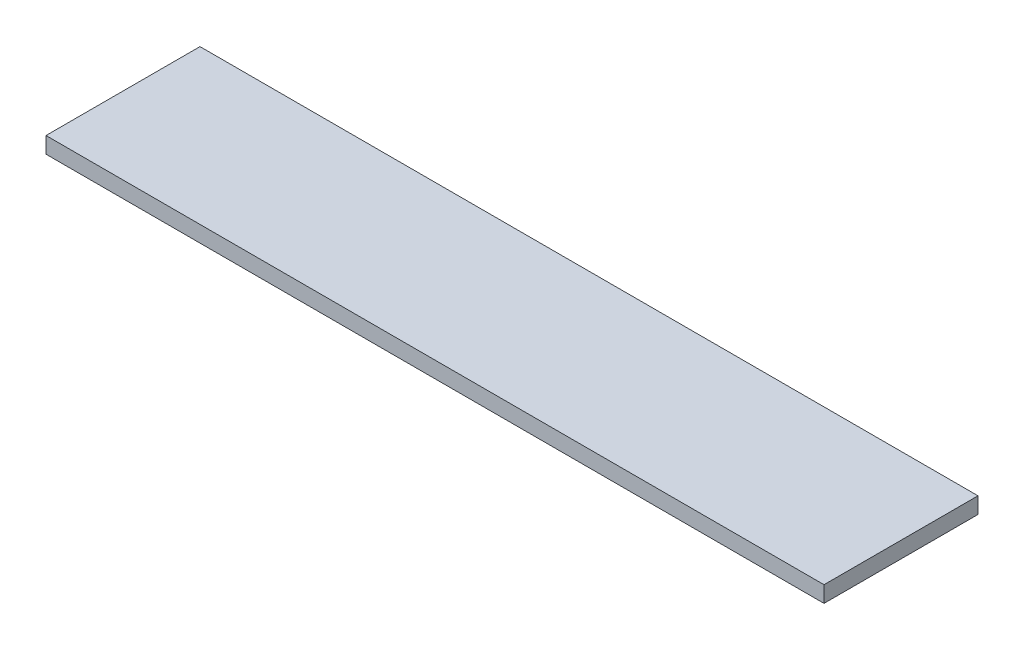
ISO-10303-21;
HEADER;
FILE_DESCRIPTION(('STEP AP214'),'2;1');
FILE_NAME('part.step','',(''),(''),'','','');
FILE_SCHEMA(('AUTOMOTIVE_DESIGN { 1 0 10303 214 1 1 1 1 }'));
ENDSEC;
DATA;
#1=APPLICATION_CONTEXT('core data for automotive mechanical design processes');
#2=APPLICATION_PROTOCOL_DEFINITION('international standard','automotive_design',2000,#1);
#3=PRODUCT_CONTEXT('',#1,'mechanical');
#4=PRODUCT('Part','Part','',(#3));
#5=PRODUCT_RELATED_PRODUCT_CATEGORY('part','',(#4));
#6=PRODUCT_DEFINITION_FORMATION('','',#4);
#7=PRODUCT_DEFINITION_CONTEXT('part definition',#1,'design');
#8=PRODUCT_DEFINITION('design','',#6,#7);
#9=PRODUCT_DEFINITION_SHAPE('','',#8);
#10=(LENGTH_UNIT() NAMED_UNIT(*) SI_UNIT(.MILLI.,.METRE.));
#11=(NAMED_UNIT(*) PLANE_ANGLE_UNIT() SI_UNIT($,.RADIAN.));
#12=(NAMED_UNIT(*) SI_UNIT($,.STERADIAN.) SOLID_ANGLE_UNIT());
#13=UNCERTAINTY_MEASURE_WITH_UNIT(LENGTH_MEASURE(1.E-05),#10,'distance_accuracy_value','');
#14=(GEOMETRIC_REPRESENTATION_CONTEXT(3) GLOBAL_UNCERTAINTY_ASSIGNED_CONTEXT((#13)) GLOBAL_UNIT_ASSIGNED_CONTEXT((#10,
#11,#12)) REPRESENTATION_CONTEXT('',''));
#15=CARTESIAN_POINT('',(0.,0.,0.));
#16=DIRECTION('',(0.,0.,1.));
#17=DIRECTION('',(1.,0.,0.));
#18=AXIS2_PLACEMENT_3D('',#15,#16,#17);
#19=CARTESIAN_POINT('',(304.8,12.7,0.));
#20=DIRECTION('',(-1.,0.,0.));
#21=DIRECTION('',(0.,0.,1.));
#22=AXIS2_PLACEMENT_3D('',#19,#20,#21);
#23=PLANE('',#22);
#24=DIRECTION('',(0.,0.,-1.));
#25=VECTOR('',#24,1.);
#26=CARTESIAN_POINT('',(304.8,0.,0.));
#27=LINE('',#26,#25);
#28=CARTESIAN_POINT('',(304.8,0.,0.));
#29=VERTEX_POINT('',#28);
#30=CARTESIAN_POINT('',(304.8,0.,-120.65));
#31=VERTEX_POINT('',#30);
#32=EDGE_CURVE('E96',#29,#31,#27,.T.);
#33=ORIENTED_EDGE('',*,*,#32,.T.);
#34=DIRECTION('',(0.,-1.,0.));
#35=VECTOR('',#34,1.);
#36=CARTESIAN_POINT('',(304.8,12.7,-120.65));
#37=LINE('',#36,#35);
#38=CARTESIAN_POINT('',(304.8,12.7,-120.65));
#39=VERTEX_POINT('',#38);
#40=EDGE_CURVE('E11',#39,#31,#37,.T.);
#41=ORIENTED_EDGE('',*,*,#40,.F.);
#42=DIRECTION('',(0.,0.,-1.));
#43=VECTOR('',#42,1.);
#44=CARTESIAN_POINT('',(304.8,12.7,0.));
#45=LINE('',#44,#43);
#46=CARTESIAN_POINT('',(304.8,12.7,0.));
#47=VERTEX_POINT('',#46);
#48=EDGE_CURVE('E84',#47,#39,#45,.T.);
#49=ORIENTED_EDGE('',*,*,#48,.F.);
#50=DIRECTION('',(0.,-1.,0.));
#51=VECTOR('',#50,1.);
#52=CARTESIAN_POINT('',(304.8,12.7,0.));
#53=LINE('',#52,#51);
#54=EDGE_CURVE('E92',#47,#29,#53,.T.);
#55=ORIENTED_EDGE('',*,*,#54,.T.);
#56=EDGE_LOOP('',(#33,#41,#49,#55));
#57=FACE_BOUND('',#56,.T.);
#58=ADVANCED_FACE('F33',(#57),#23,.F.);
#59=CARTESIAN_POINT('',(-304.8,12.7,-120.65));
#60=DIRECTION('',(0.,0.,1.));
#61=DIRECTION('',(1.,0.,0.));
#62=AXIS2_PLACEMENT_3D('',#59,#60,#61);
#63=PLANE('',#62);
#64=DIRECTION('',(-1.,0.,0.));
#65=VECTOR('',#64,1.);
#66=CARTESIAN_POINT('',(-304.8,0.,-120.65));
#67=LINE('',#66,#65);
#68=CARTESIAN_POINT('',(-304.8,0.,-120.65));
#69=VERTEX_POINT('',#68);
#70=EDGE_CURVE('E88',#31,#69,#67,.T.);
#71=ORIENTED_EDGE('',*,*,#70,.T.);
#72=DIRECTION('',(0.,-1.,0.));
#73=VECTOR('',#72,1.);
#74=CARTESIAN_POINT('',(-304.8,12.7,-120.65));
#75=LINE('',#74,#73);
#76=CARTESIAN_POINT('',(-304.8,12.7,-120.65));
#77=VERTEX_POINT('',#76);
#78=EDGE_CURVE('E41',#77,#69,#75,.T.);
#79=ORIENTED_EDGE('',*,*,#78,.F.);
#80=DIRECTION('',(-1.,0.,0.));
#81=VECTOR('',#80,1.);
#82=CARTESIAN_POINT('',(-304.8,12.7,-120.65));
#83=LINE('',#82,#81);
#84=EDGE_CURVE('E79',#39,#77,#83,.T.);
#85=ORIENTED_EDGE('',*,*,#84,.F.);
#86=ORIENTED_EDGE('',*,*,#40,.T.);
#87=EDGE_LOOP('',(#71,#79,#85,#86));
#88=FACE_BOUND('',#87,.T.);
#89=ADVANCED_FACE('F87',(#88),#63,.F.);
#90=CARTESIAN_POINT('',(-304.8,12.7,0.));
#91=DIRECTION('',(1.,0.,0.));
#92=DIRECTION('',(0.,0.,-1.));
#93=AXIS2_PLACEMENT_3D('',#90,#91,#92);
#94=PLANE('',#93);
#95=DIRECTION('',(0.,0.,1.));
#96=VECTOR('',#95,1.);
#97=CARTESIAN_POINT('',(-304.8,0.,0.));
#98=LINE('',#97,#96);
#99=CARTESIAN_POINT('',(-304.8,0.,0.));
#100=VERTEX_POINT('',#99);
#101=EDGE_CURVE('E66',#69,#100,#98,.T.);
#102=ORIENTED_EDGE('',*,*,#101,.T.);
#103=DIRECTION('',(0.,-1.,0.));
#104=VECTOR('',#103,1.);
#105=CARTESIAN_POINT('',(-304.8,12.7,0.));
#106=LINE('',#105,#104);
#107=CARTESIAN_POINT('',(-304.8,12.7,0.));
#108=VERTEX_POINT('',#107);
#109=EDGE_CURVE('E89',#108,#100,#106,.T.);
#110=ORIENTED_EDGE('',*,*,#109,.F.);
#111=DIRECTION('',(0.,0.,1.));
#112=VECTOR('',#111,1.);
#113=CARTESIAN_POINT('',(-304.8,12.7,0.));
#114=LINE('',#113,#112);
#115=EDGE_CURVE('E82',#77,#108,#114,.T.);
#116=ORIENTED_EDGE('',*,*,#115,.F.);
#117=ORIENTED_EDGE('',*,*,#78,.T.);
#118=EDGE_LOOP('',(#102,#110,#116,#117));
#119=FACE_BOUND('',#118,.T.);
#120=ADVANCED_FACE('F90',(#119),#94,.F.);
#121=CARTESIAN_POINT('',(-304.8,12.7,0.));
#122=DIRECTION('',(0.,0.,-1.));
#123=DIRECTION('',(-1.,0.,0.));
#124=AXIS2_PLACEMENT_3D('',#121,#122,#123);
#125=PLANE('',#124);
#126=DIRECTION('',(1.,0.,0.));
#127=VECTOR('',#126,1.);
#128=CARTESIAN_POINT('',(-304.8,0.,0.));
#129=LINE('',#128,#127);
#130=EDGE_CURVE('E72',#100,#29,#129,.T.);
#131=ORIENTED_EDGE('',*,*,#130,.T.);
#132=ORIENTED_EDGE('',*,*,#54,.F.);
#133=DIRECTION('',(1.,0.,0.));
#134=VECTOR('',#133,1.);
#135=CARTESIAN_POINT('',(-304.8,12.7,0.));
#136=LINE('',#135,#134);
#137=EDGE_CURVE('E49',#108,#47,#136,.T.);
#138=ORIENTED_EDGE('',*,*,#137,.F.);
#139=ORIENTED_EDGE('',*,*,#109,.T.);
#140=EDGE_LOOP('',(#131,#132,#138,#139));
#141=FACE_BOUND('',#140,.T.);
#142=ADVANCED_FACE('F103',(#141),#125,.F.);
#143=CARTESIAN_POINT('',(0.,12.7,0.));
#144=DIRECTION('',(0.,-1.,0.));
#145=DIRECTION('',(0.,0.,-1.));
#146=AXIS2_PLACEMENT_3D('',#143,#144,#145);
#147=PLANE('',#146);
#148=ORIENTED_EDGE('',*,*,#48,.T.);
#149=ORIENTED_EDGE('',*,*,#84,.T.);
#150=ORIENTED_EDGE('',*,*,#115,.T.);
#151=ORIENTED_EDGE('',*,*,#137,.T.);
#152=EDGE_LOOP('',(#148,#149,#150,#151));
#153=FACE_BOUND('',#152,.T.);
#154=ADVANCED_FACE('F80',(#153),#147,.F.);
#155=CARTESIAN_POINT('',(0.,0.,0.));
#156=DIRECTION('',(0.,-1.,0.));
#157=DIRECTION('',(0.,0.,-1.));
#158=AXIS2_PLACEMENT_3D('',#155,#156,#157);
#159=PLANE('',#158);
#160=ORIENTED_EDGE('',*,*,#32,.F.);
#161=ORIENTED_EDGE('',*,*,#130,.F.);
#162=ORIENTED_EDGE('',*,*,#101,.F.);
#163=ORIENTED_EDGE('',*,*,#70,.F.);
#164=EDGE_LOOP('',(#160,#161,#162,#163));
#165=FACE_BOUND('',#164,.T.);
#166=ADVANCED_FACE('F106',(#165),#159,.T.);
#167=CLOSED_SHELL('',(#58,#89,#120,#142,#154,#166));
#168=MANIFOLD_SOLID_BREP('B2',#167);
#169=ADVANCED_BREP_SHAPE_REPRESENTATION('',(#18,#168),#14);
#170=SHAPE_DEFINITION_REPRESENTATION(#9,#169);
ENDSEC;
END-ISO-10303-21;
